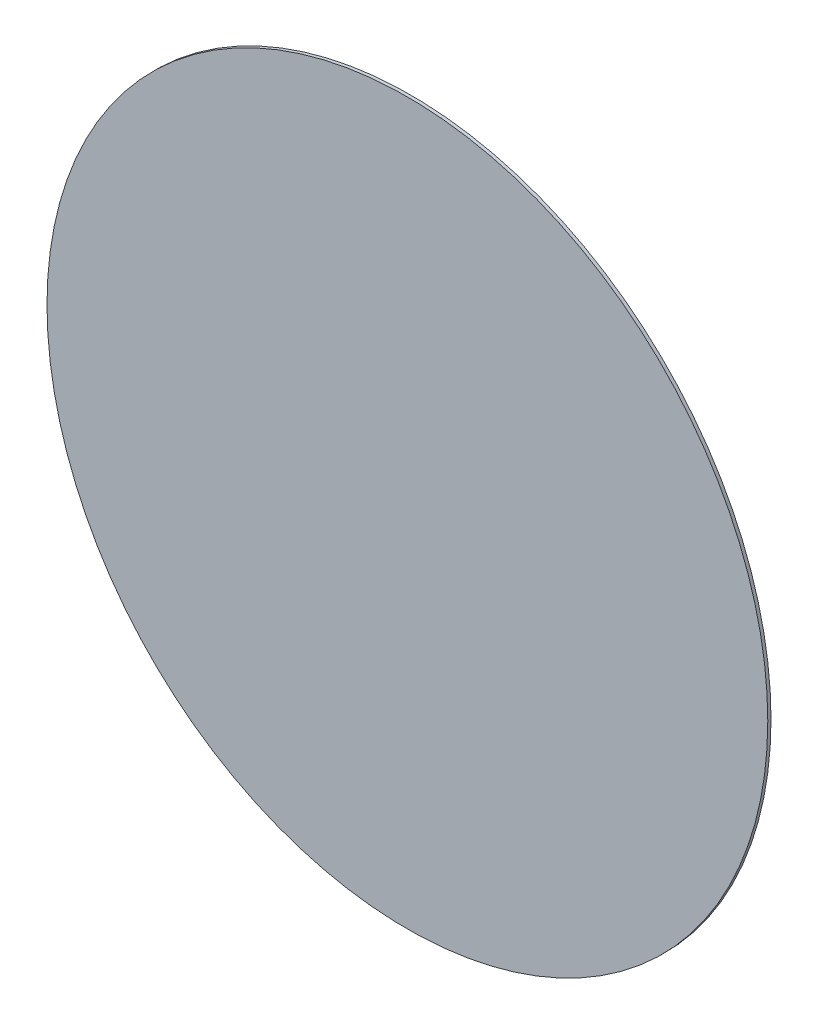
ISO-10303-21;
HEADER;
FILE_DESCRIPTION(('STEP AP214'),'2;1');
FILE_NAME('part.step','',(''),(''),'','','');
FILE_SCHEMA(('AUTOMOTIVE_DESIGN { 1 0 10303 214 1 1 1 1 }'));
ENDSEC;
DATA;
#1=APPLICATION_CONTEXT('core data for automotive mechanical design processes');
#2=APPLICATION_PROTOCOL_DEFINITION('international standard','automotive_design',2000,#1);
#3=PRODUCT_CONTEXT('',#1,'mechanical');
#4=PRODUCT('Part','Part','',(#3));
#5=PRODUCT_RELATED_PRODUCT_CATEGORY('part','',(#4));
#6=PRODUCT_DEFINITION_FORMATION('','',#4);
#7=PRODUCT_DEFINITION_CONTEXT('part definition',#1,'design');
#8=PRODUCT_DEFINITION('design','',#6,#7);
#9=PRODUCT_DEFINITION_SHAPE('','',#8);
#10=(LENGTH_UNIT() NAMED_UNIT(*) SI_UNIT(.MILLI.,.METRE.));
#11=(NAMED_UNIT(*) PLANE_ANGLE_UNIT() SI_UNIT($,.RADIAN.));
#12=(NAMED_UNIT(*) SI_UNIT($,.STERADIAN.) SOLID_ANGLE_UNIT());
#13=UNCERTAINTY_MEASURE_WITH_UNIT(LENGTH_MEASURE(1.E-05),#10,'distance_accuracy_value','');
#14=(GEOMETRIC_REPRESENTATION_CONTEXT(3) GLOBAL_UNCERTAINTY_ASSIGNED_CONTEXT((#13)) GLOBAL_UNIT_ASSIGNED_CONTEXT((#10,
#11,#12)) REPRESENTATION_CONTEXT('',''));
#15=CARTESIAN_POINT('',(0.,0.,0.));
#16=DIRECTION('',(0.,0.,1.));
#17=DIRECTION('',(1.,0.,0.));
#18=AXIS2_PLACEMENT_3D('',#15,#16,#17);
#19=CARTESIAN_POINT('',(2.79999948,0.,0.02500122));
#20=DIRECTION('',(0.,0.,-1.));
#21=DIRECTION('',(-1.,0.,0.));
#22=AXIS2_PLACEMENT_3D('',#19,#20,#21);
#23=PLANE('',#22);
#24=CARTESIAN_POINT('',(0.,0.,0.02500122));
#25=DIRECTION('',(0.,0.,-1.));
#26=DIRECTION('',(-1.,0.,0.));
#27=AXIS2_PLACEMENT_3D('',#24,#25,#26);
#28=CIRCLE('',#27,2.79999948);
#29=CARTESIAN_POINT('',(-2.79999948,0.,0.02500122));
#30=VERTEX_POINT('',#29);
#31=EDGE_CURVE('E17',#30,#30,#28,.T.);
#32=ORIENTED_EDGE('',*,*,#31,.F.);
#33=EDGE_LOOP('',(#32));
#34=FACE_BOUND('',#33,.T.);
#35=ADVANCED_FACE('F14',(#34),#23,.F.);
#36=CARTESIAN_POINT('',(0.,0.,0.));
#37=DIRECTION('',(0.,0.,-1.));
#38=DIRECTION('',(-1.,0.,0.));
#39=AXIS2_PLACEMENT_3D('',#36,#37,#38);
#40=CYLINDRICAL_SURFACE('',#39,2.79999948);
#41=ORIENTED_EDGE('',*,*,#31,.T.);
#42=EDGE_LOOP('',(#41));
#43=FACE_BOUND('',#42,.T.);
#44=CARTESIAN_POINT('',(0.,0.,0.));
#45=DIRECTION('',(0.,0.,-1.));
#46=DIRECTION('',(-1.,0.,0.));
#47=AXIS2_PLACEMENT_3D('',#44,#45,#46);
#48=CIRCLE('',#47,2.79999948);
#49=CARTESIAN_POINT('',(-2.79999948,0.,0.));
#50=VERTEX_POINT('',#49);
#51=EDGE_CURVE('E10',#50,#50,#48,.T.);
#52=ORIENTED_EDGE('',*,*,#51,.F.);
#53=EDGE_LOOP('',(#52));
#54=FACE_BOUND('',#53,.T.);
#55=ADVANCED_FACE('F26',(#43,#54),#40,.T.);
#56=CARTESIAN_POINT('',(2.79999948,0.,0.));
#57=DIRECTION('',(0.,0.,-1.));
#58=DIRECTION('',(-1.,0.,0.));
#59=AXIS2_PLACEMENT_3D('',#56,#57,#58);
#60=PLANE('',#59);
#61=ORIENTED_EDGE('',*,*,#51,.T.);
#62=EDGE_LOOP('',(#61));
#63=FACE_BOUND('',#62,.T.);
#64=ADVANCED_FACE('F34',(#63),#60,.T.);
#65=CLOSED_SHELL('',(#35,#55,#64));
#66=MANIFOLD_SOLID_BREP('B1',#65);
#67=ADVANCED_BREP_SHAPE_REPRESENTATION('',(#18,#66),#14);
#68=SHAPE_DEFINITION_REPRESENTATION(#9,#67);
ENDSEC;
END-ISO-10303-21;
